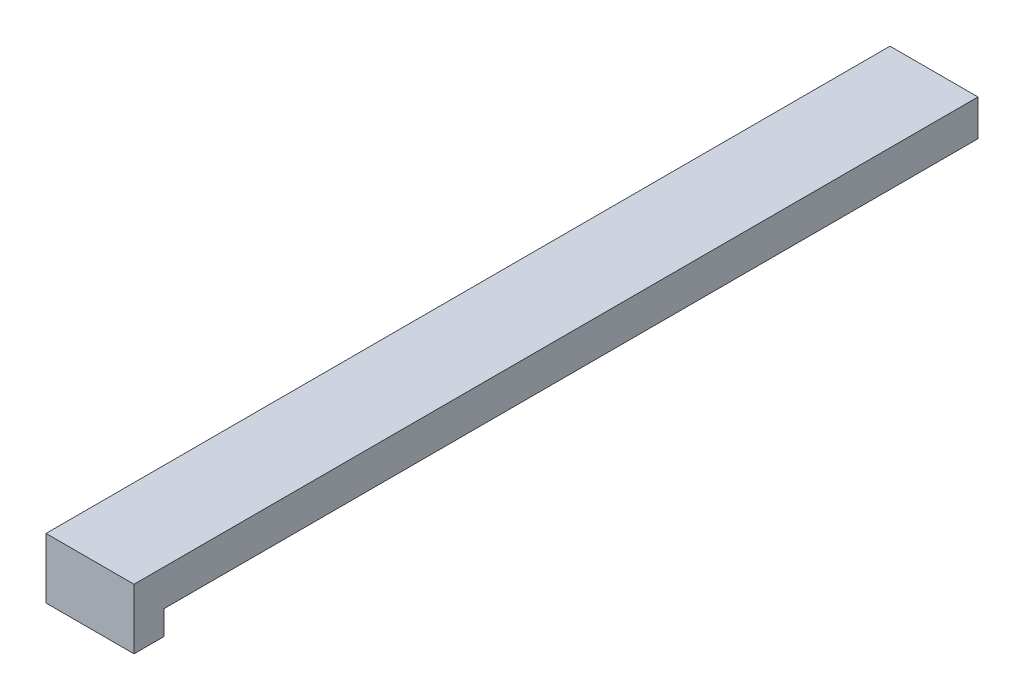
ISO-10303-21;
HEADER;
FILE_DESCRIPTION(('STEP AP214'),'2;1');
FILE_NAME('part.step','',(''),(''),'','','');
FILE_SCHEMA(('AUTOMOTIVE_DESIGN { 1 0 10303 214 1 1 1 1 }'));
ENDSEC;
DATA;
#1=APPLICATION_CONTEXT('core data for automotive mechanical design processes');
#2=APPLICATION_PROTOCOL_DEFINITION('international standard','automotive_design',2000,#1);
#3=PRODUCT_CONTEXT('',#1,'mechanical');
#4=PRODUCT('Part','Part','',(#3));
#5=PRODUCT_RELATED_PRODUCT_CATEGORY('part','',(#4));
#6=PRODUCT_DEFINITION_FORMATION('','',#4);
#7=PRODUCT_DEFINITION_CONTEXT('part definition',#1,'design');
#8=PRODUCT_DEFINITION('design','',#6,#7);
#9=PRODUCT_DEFINITION_SHAPE('','',#8);
#10=(LENGTH_UNIT() NAMED_UNIT(*) SI_UNIT(.MILLI.,.METRE.));
#11=(NAMED_UNIT(*) PLANE_ANGLE_UNIT() SI_UNIT($,.RADIAN.));
#12=(NAMED_UNIT(*) SI_UNIT($,.STERADIAN.) SOLID_ANGLE_UNIT());
#13=UNCERTAINTY_MEASURE_WITH_UNIT(LENGTH_MEASURE(1.E-05),#10,'distance_accuracy_value','');
#14=(GEOMETRIC_REPRESENTATION_CONTEXT(3) GLOBAL_UNCERTAINTY_ASSIGNED_CONTEXT((#13)) GLOBAL_UNIT_ASSIGNED_CONTEXT((#10,
#11,#12)) REPRESENTATION_CONTEXT('',''));
#15=CARTESIAN_POINT('',(0.,0.,0.));
#16=DIRECTION('',(0.,0.,1.));
#17=DIRECTION('',(1.,0.,0.));
#18=AXIS2_PLACEMENT_3D('',#15,#16,#17);
#19=CARTESIAN_POINT('',(7.3,0.,140.));
#20=DIRECTION('',(0.,-1.,0.));
#21=DIRECTION('',(1.,0.,0.));
#22=AXIS2_PLACEMENT_3D('',#19,#20,#21);
#23=PLANE('',#22);
#24=DIRECTION('',(-1.,0.,0.));
#25=VECTOR('',#24,1.);
#26=CARTESIAN_POINT('',(7.3,0.,0.));
#27=LINE('',#26,#25);
#28=CARTESIAN_POINT('',(7.3,0.,0.));
#29=VERTEX_POINT('',#28);
#30=CARTESIAN_POINT('',(-7.3,0.,0.));
#31=VERTEX_POINT('',#30);
#32=EDGE_CURVE('E88',#29,#31,#27,.T.);
#33=ORIENTED_EDGE('',*,*,#32,.T.);
#34=DIRECTION('',(0.,0.,-1.));
#35=VECTOR('',#34,1.);
#36=CARTESIAN_POINT('',(-7.3,0.,140.));
#37=LINE('',#36,#35);
#38=CARTESIAN_POINT('',(-7.3,0.,140.));
#39=VERTEX_POINT('',#38);
#40=EDGE_CURVE('E11',#39,#31,#37,.T.);
#41=ORIENTED_EDGE('',*,*,#40,.F.);
#42=DIRECTION('',(-1.,0.,0.));
#43=VECTOR('',#42,1.);
#44=CARTESIAN_POINT('',(7.3,0.,140.));
#45=LINE('',#44,#43);
#46=CARTESIAN_POINT('',(7.3,0.,140.));
#47=VERTEX_POINT('',#46);
#48=EDGE_CURVE('E89',#47,#39,#45,.T.);
#49=ORIENTED_EDGE('',*,*,#48,.F.);
#50=DIRECTION('',(0.,0.,-1.));
#51=VECTOR('',#50,1.);
#52=CARTESIAN_POINT('',(7.3,0.,140.));
#53=LINE('',#52,#51);
#54=EDGE_CURVE('E85',#47,#29,#53,.T.);
#55=ORIENTED_EDGE('',*,*,#54,.T.);
#56=EDGE_LOOP('',(#33,#41,#49,#55));
#57=FACE_BOUND('',#56,.T.);
#58=ADVANCED_FACE('F45',(#57),#23,.F.);
#59=CARTESIAN_POINT('',(-7.3,0.,140.));
#60=DIRECTION('',(1.,0.,0.));
#61=DIRECTION('',(0.,0.,-1.));
#62=AXIS2_PLACEMENT_3D('',#59,#60,#61);
#63=PLANE('',#62);
#64=DIRECTION('',(0.,0.,-1.));
#65=VECTOR('',#64,1.);
#66=CARTESIAN_POINT('',(-7.3,-6.,140.));
#67=LINE('',#66,#65);
#68=CARTESIAN_POINT('',(-7.3,-6.00000000000001,135.));
#69=VERTEX_POINT('',#68);
#70=CARTESIAN_POINT('',(-7.3,-6.,0.));
#71=VERTEX_POINT('',#70);
#72=EDGE_CURVE('E54',#69,#71,#67,.T.);
#73=ORIENTED_EDGE('',*,*,#72,.F.);
#74=DIRECTION('',(0.,1.,0.));
#75=VECTOR('',#74,1.);
#76=CARTESIAN_POINT('',(-7.3,-10.,135.));
#77=LINE('',#76,#75);
#78=CARTESIAN_POINT('',(-7.3,-10.,135.));
#79=VERTEX_POINT('',#78);
#80=EDGE_CURVE('E185',#79,#69,#77,.T.);
#81=ORIENTED_EDGE('',*,*,#80,.F.);
#82=DIRECTION('',(0.,0.,1.));
#83=VECTOR('',#82,1.);
#84=CARTESIAN_POINT('',(-7.3,-10.,140.));
#85=LINE('',#84,#83);
#86=CARTESIAN_POINT('',(-7.3,-10.,140.));
#87=VERTEX_POINT('',#86);
#88=EDGE_CURVE('E152',#79,#87,#85,.T.);
#89=ORIENTED_EDGE('',*,*,#88,.T.);
#90=DIRECTION('',(0.,-1.,0.));
#91=VECTOR('',#90,1.);
#92=CARTESIAN_POINT('',(-7.3,0.,140.));
#93=LINE('',#92,#91);
#94=EDGE_CURVE('E149',#39,#87,#93,.T.);
#95=ORIENTED_EDGE('',*,*,#94,.F.);
#96=ORIENTED_EDGE('',*,*,#40,.T.);
#97=DIRECTION('',(0.,-1.,0.));
#98=VECTOR('',#97,1.);
#99=CARTESIAN_POINT('',(-7.3,0.,0.));
#100=LINE('',#99,#98);
#101=EDGE_CURVE('E103',#31,#71,#100,.T.);
#102=ORIENTED_EDGE('',*,*,#101,.T.);
#103=EDGE_LOOP('',(#73,#81,#89,#95,#96,#102));
#104=FACE_BOUND('',#103,.T.);
#105=ADVANCED_FACE('F146',(#104),#63,.F.);
#106=CARTESIAN_POINT('',(-4.3,-6.,140.));
#107=DIRECTION('',(-1.,0.,0.));
#108=DIRECTION('',(0.,-1.,0.));
#109=AXIS2_PLACEMENT_3D('',#106,#107,#108);
#110=PLANE('',#109);
#111=DIRECTION('',(0.,0.,-1.));
#112=VECTOR('',#111,1.);
#113=CARTESIAN_POINT('',(-4.3,-2.,140.));
#114=LINE('',#113,#112);
#115=CARTESIAN_POINT('',(-4.3,-2.,135.));
#116=VERTEX_POINT('',#115);
#117=CARTESIAN_POINT('',(-4.3,-2.,5.));
#118=VERTEX_POINT('',#117);
#119=EDGE_CURVE('E128',#116,#118,#114,.T.);
#120=ORIENTED_EDGE('',*,*,#119,.F.);
#121=DIRECTION('',(0.,-1.,0.));
#122=VECTOR('',#121,1.);
#123=CARTESIAN_POINT('',(-4.3,-6.,135.));
#124=LINE('',#123,#122);
#125=CARTESIAN_POINT('',(-4.3,-6.00000000000001,135.));
#126=VERTEX_POINT('',#125);
#127=EDGE_CURVE('E179',#116,#126,#124,.T.);
#128=ORIENTED_EDGE('',*,*,#127,.T.);
#129=DIRECTION('',(0.,0.,-1.));
#130=VECTOR('',#129,1.);
#131=CARTESIAN_POINT('',(-4.3,-6.,140.));
#132=LINE('',#131,#130);
#133=CARTESIAN_POINT('',(-4.3,-6.00000000000001,5.));
#134=VERTEX_POINT('',#133);
#135=EDGE_CURVE('E132',#126,#134,#132,.T.);
#136=ORIENTED_EDGE('',*,*,#135,.T.);
#137=DIRECTION('',(0.,1.,0.));
#138=VECTOR('',#137,1.);
#139=CARTESIAN_POINT('',(-4.3,-6.,5.));
#140=LINE('',#139,#138);
#141=EDGE_CURVE('E105',#134,#118,#140,.T.);
#142=ORIENTED_EDGE('',*,*,#141,.T.);
#143=EDGE_LOOP('',(#120,#128,#136,#142));
#144=FACE_BOUND('',#143,.T.);
#145=ADVANCED_FACE('F235',(#144),#110,.F.);
#146=CARTESIAN_POINT('',(-4.3,-2.,140.));
#147=DIRECTION('',(0.,1.,0.));
#148=DIRECTION('',(-1.,0.,0.));
#149=AXIS2_PLACEMENT_3D('',#146,#147,#148);
#150=PLANE('',#149);
#151=DIRECTION('',(0.,0.,-1.));
#152=VECTOR('',#151,1.);
#153=CARTESIAN_POINT('',(4.3,-2.00000000000001,140.));
#154=LINE('',#153,#152);
#155=CARTESIAN_POINT('',(4.3,-2.00000000000001,135.));
#156=VERTEX_POINT('',#155);
#157=CARTESIAN_POINT('',(4.3,-2.00000000000001,5.));
#158=VERTEX_POINT('',#157);
#159=EDGE_CURVE('E124',#156,#158,#154,.T.);
#160=ORIENTED_EDGE('',*,*,#159,.F.);
#161=DIRECTION('',(-1.,0.,0.));
#162=VECTOR('',#161,1.);
#163=CARTESIAN_POINT('',(-4.3,-2.,135.));
#164=LINE('',#163,#162);
#165=EDGE_CURVE('E175',#156,#116,#164,.T.);
#166=ORIENTED_EDGE('',*,*,#165,.T.);
#167=ORIENTED_EDGE('',*,*,#119,.T.);
#168=DIRECTION('',(1.,0.,0.));
#169=VECTOR('',#168,1.);
#170=CARTESIAN_POINT('',(-4.3,-2.,5.));
#171=LINE('',#170,#169);
#172=EDGE_CURVE('E111',#118,#158,#171,.T.);
#173=ORIENTED_EDGE('',*,*,#172,.T.);
#174=EDGE_LOOP('',(#160,#166,#167,#173));
#175=FACE_BOUND('',#174,.T.);
#176=ADVANCED_FACE('F230',(#175),#150,.F.);
#177=CARTESIAN_POINT('',(4.3,-2.00000000000001,140.));
#178=DIRECTION('',(1.,0.,0.));
#179=DIRECTION('',(0.,1.,0.));
#180=AXIS2_PLACEMENT_3D('',#177,#178,#179);
#181=PLANE('',#180);
#182=DIRECTION('',(0.,0.,-1.));
#183=VECTOR('',#182,1.);
#184=CARTESIAN_POINT('',(4.3,-6.00000000000001,140.));
#185=LINE('',#184,#183);
#186=CARTESIAN_POINT('',(4.3,-6.00000000000001,135.));
#187=VERTEX_POINT('',#186);
#188=CARTESIAN_POINT('',(4.3,-6.,5.));
#189=VERTEX_POINT('',#188);
#190=EDGE_CURVE('E120',#187,#189,#185,.T.);
#191=ORIENTED_EDGE('',*,*,#190,.F.);
#192=DIRECTION('',(0.,1.,0.));
#193=VECTOR('',#192,1.);
#194=CARTESIAN_POINT('',(4.3,-2.00000000000001,135.));
#195=LINE('',#194,#193);
#196=EDGE_CURVE('E171',#187,#156,#195,.T.);
#197=ORIENTED_EDGE('',*,*,#196,.T.);
#198=ORIENTED_EDGE('',*,*,#159,.T.);
#199=DIRECTION('',(0.,-1.,0.));
#200=VECTOR('',#199,1.);
#201=CARTESIAN_POINT('',(4.3,-2.00000000000001,5.));
#202=LINE('',#201,#200);
#203=EDGE_CURVE('E162',#158,#189,#202,.T.);
#204=ORIENTED_EDGE('',*,*,#203,.T.);
#205=EDGE_LOOP('',(#191,#197,#198,#204));
#206=FACE_BOUND('',#205,.T.);
#207=ADVANCED_FACE('F218',(#206),#181,.F.);
#208=CARTESIAN_POINT('',(4.3,-6.00000000000001,140.));
#209=DIRECTION('',(0.,1.,0.));
#210=DIRECTION('',(-1.,0.,0.));
#211=AXIS2_PLACEMENT_3D('',#208,#209,#210);
#212=PLANE('',#211);
#213=DIRECTION('',(0.,0.,-1.));
#214=VECTOR('',#213,1.);
#215=CARTESIAN_POINT('',(7.3,-6.,140.));
#216=LINE('',#215,#214);
#217=CARTESIAN_POINT('',(7.3,-6.,135.));
#218=VERTEX_POINT('',#217);
#219=CARTESIAN_POINT('',(7.3,-6.,0.));
#220=VERTEX_POINT('',#219);
#221=EDGE_CURVE('E79',#218,#220,#216,.T.);
#222=ORIENTED_EDGE('',*,*,#221,.F.);
#223=DIRECTION('',(-1.,0.,0.));
#224=VECTOR('',#223,1.);
#225=CARTESIAN_POINT('',(4.3,-6.00000000000001,135.));
#226=LINE('',#225,#224);
#227=EDGE_CURVE('E170',#218,#187,#226,.T.);
#228=ORIENTED_EDGE('',*,*,#227,.T.);
#229=ORIENTED_EDGE('',*,*,#190,.T.);
#230=DIRECTION('',(-1.,0.,0.));
#231=VECTOR('',#230,1.);
#232=CARTESIAN_POINT('',(-7.3,-6.00000000000001,5.));
#233=LINE('',#232,#231);
#234=EDGE_CURVE('E166',#189,#134,#233,.T.);
#235=ORIENTED_EDGE('',*,*,#234,.T.);
#236=ORIENTED_EDGE('',*,*,#135,.F.);
#237=EDGE_CURVE('E143',#126,#69,#226,.T.);
#238=ORIENTED_EDGE('',*,*,#237,.T.);
#239=ORIENTED_EDGE('',*,*,#72,.T.);
#240=DIRECTION('',(1.,0.,0.));
#241=VECTOR('',#240,1.);
#242=CARTESIAN_POINT('',(4.3,-6.00000000000001,0.));
#243=LINE('',#242,#241);
#244=EDGE_CURVE('E98',#71,#220,#243,.T.);
#245=ORIENTED_EDGE('',*,*,#244,.T.);
#246=EDGE_LOOP('',(#222,#228,#229,#235,#236,#238,#239,#245));
#247=FACE_BOUND('',#246,.T.);
#248=ADVANCED_FACE('F139',(#247),#212,.F.);
#249=CARTESIAN_POINT('',(7.3,-6.,140.));
#250=DIRECTION('',(-1.,0.,0.));
#251=DIRECTION('',(0.,0.,1.));
#252=AXIS2_PLACEMENT_3D('',#249,#250,#251);
#253=PLANE('',#252);
#254=DIRECTION('',(0.,1.,0.));
#255=VECTOR('',#254,1.);
#256=CARTESIAN_POINT('',(7.3,-6.,0.));
#257=LINE('',#256,#255);
#258=EDGE_CURVE('E93',#220,#29,#257,.T.);
#259=ORIENTED_EDGE('',*,*,#258,.T.);
#260=ORIENTED_EDGE('',*,*,#54,.F.);
#261=DIRECTION('',(0.,1.,0.));
#262=VECTOR('',#261,1.);
#263=CARTESIAN_POINT('',(7.3,-6.,140.));
#264=LINE('',#263,#262);
#265=CARTESIAN_POINT('',(7.3,-10.,140.));
#266=VERTEX_POINT('',#265);
#267=EDGE_CURVE('E62',#266,#47,#264,.T.);
#268=ORIENTED_EDGE('',*,*,#267,.F.);
#269=DIRECTION('',(0.,0.,-1.));
#270=VECTOR('',#269,1.);
#271=CARTESIAN_POINT('',(7.3,-10.,140.));
#272=LINE('',#271,#270);
#273=CARTESIAN_POINT('',(7.3,-10.,135.));
#274=VERTEX_POINT('',#273);
#275=EDGE_CURVE('E196',#266,#274,#272,.T.);
#276=ORIENTED_EDGE('',*,*,#275,.T.);
#277=DIRECTION('',(0.,1.,0.));
#278=VECTOR('',#277,1.);
#279=CARTESIAN_POINT('',(7.3,-10.,135.));
#280=LINE('',#279,#278);
#281=EDGE_CURVE('E186',#274,#218,#280,.T.);
#282=ORIENTED_EDGE('',*,*,#281,.T.);
#283=ORIENTED_EDGE('',*,*,#221,.T.);
#284=EDGE_LOOP('',(#259,#260,#268,#276,#282,#283));
#285=FACE_BOUND('',#284,.T.);
#286=ADVANCED_FACE('F94',(#285),#253,.F.);
#287=CARTESIAN_POINT('',(0.,0.,140.));
#288=DIRECTION('',(0.,0.,1.));
#289=DIRECTION('',(1.,0.,0.));
#290=AXIS2_PLACEMENT_3D('',#287,#288,#289);
#291=PLANE('',#290);
#292=ORIENTED_EDGE('',*,*,#48,.T.);
#293=ORIENTED_EDGE('',*,*,#94,.T.);
#294=DIRECTION('',(1.,0.,0.));
#295=VECTOR('',#294,1.);
#296=CARTESIAN_POINT('',(-7.3,-10.,140.));
#297=LINE('',#296,#295);
#298=EDGE_CURVE('E200',#87,#266,#297,.T.);
#299=ORIENTED_EDGE('',*,*,#298,.T.);
#300=ORIENTED_EDGE('',*,*,#267,.T.);
#301=EDGE_LOOP('',(#292,#293,#299,#300));
#302=FACE_BOUND('',#301,.T.);
#303=ADVANCED_FACE('F155',(#302),#291,.T.);
#304=CARTESIAN_POINT('',(0.,0.,0.));
#305=DIRECTION('',(0.,0.,1.));
#306=DIRECTION('',(1.,0.,0.));
#307=AXIS2_PLACEMENT_3D('',#304,#305,#306);
#308=PLANE('',#307);
#309=ORIENTED_EDGE('',*,*,#32,.F.);
#310=ORIENTED_EDGE('',*,*,#258,.F.);
#311=ORIENTED_EDGE('',*,*,#244,.F.);
#312=ORIENTED_EDGE('',*,*,#101,.F.);
#313=EDGE_LOOP('',(#309,#310,#311,#312));
#314=FACE_BOUND('',#313,.T.);
#315=ADVANCED_FACE('F101',(#314),#308,.F.);
#316=CARTESIAN_POINT('',(-7.3,0.,5.));
#317=DIRECTION('',(0.,0.,1.));
#318=DIRECTION('',(1.,0.,0.));
#319=AXIS2_PLACEMENT_3D('',#316,#317,#318);
#320=PLANE('',#319);
#321=ORIENTED_EDGE('',*,*,#141,.F.);
#322=ORIENTED_EDGE('',*,*,#234,.F.);
#323=ORIENTED_EDGE('',*,*,#203,.F.);
#324=ORIENTED_EDGE('',*,*,#172,.F.);
#325=EDGE_LOOP('',(#321,#322,#323,#324));
#326=FACE_BOUND('',#325,.T.);
#327=ADVANCED_FACE('F227',(#326),#320,.T.);
#328=CARTESIAN_POINT('',(-7.3,-10.,135.));
#329=DIRECTION('',(0.,0.,-1.));
#330=DIRECTION('',(-1.,0.,0.));
#331=AXIS2_PLACEMENT_3D('',#328,#329,#330);
#332=PLANE('',#331);
#333=ORIENTED_EDGE('',*,*,#227,.F.);
#334=ORIENTED_EDGE('',*,*,#281,.F.);
#335=DIRECTION('',(-1.,0.,0.));
#336=VECTOR('',#335,1.);
#337=CARTESIAN_POINT('',(-7.3,-10.,135.));
#338=LINE('',#337,#336);
#339=EDGE_CURVE('E189',#274,#79,#338,.T.);
#340=ORIENTED_EDGE('',*,*,#339,.T.);
#341=ORIENTED_EDGE('',*,*,#80,.T.);
#342=ORIENTED_EDGE('',*,*,#237,.F.);
#343=ORIENTED_EDGE('',*,*,#127,.F.);
#344=ORIENTED_EDGE('',*,*,#165,.F.);
#345=ORIENTED_EDGE('',*,*,#196,.F.);
#346=EDGE_LOOP('',(#333,#334,#340,#341,#342,#343,#344,#345));
#347=FACE_BOUND('',#346,.T.);
#348=ADVANCED_FACE('F256',(#347),#332,.T.);
#349=CARTESIAN_POINT('',(0.,-10.,0.));
#350=DIRECTION('',(0.,-1.,0.));
#351=DIRECTION('',(1.,0.,0.));
#352=AXIS2_PLACEMENT_3D('',#349,#350,#351);
#353=PLANE('',#352);
#354=ORIENTED_EDGE('',*,*,#88,.F.);
#355=ORIENTED_EDGE('',*,*,#339,.F.);
#356=ORIENTED_EDGE('',*,*,#275,.F.);
#357=ORIENTED_EDGE('',*,*,#298,.F.);
#358=EDGE_LOOP('',(#354,#355,#356,#357));
#359=FACE_BOUND('',#358,.T.);
#360=ADVANCED_FACE('F255',(#359),#353,.T.);
#361=CLOSED_SHELL('',(#58,#105,#145,#176,#207,#248,#286,#303,#315,#327,#348,#360));
#362=MANIFOLD_SOLID_BREP('B2',#361);
#363=ADVANCED_BREP_SHAPE_REPRESENTATION('',(#18,#362),#14);
#364=SHAPE_DEFINITION_REPRESENTATION(#9,#363);
ENDSEC;
END-ISO-10303-21;
